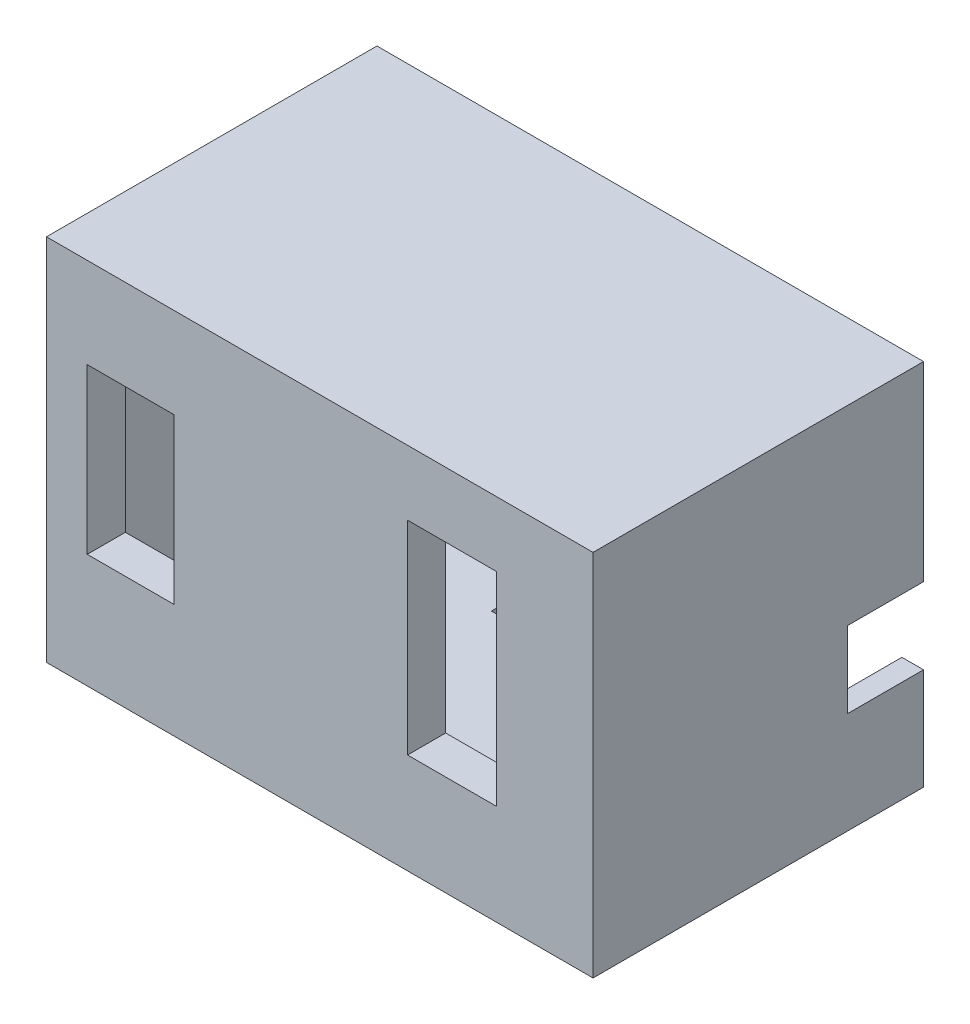
ISO-10303-21;
HEADER;
FILE_DESCRIPTION(('STEP AP214'),'2;1');
FILE_NAME('part.step','',(''),(''),'','','');
FILE_SCHEMA(('AUTOMOTIVE_DESIGN { 1 0 10303 214 1 1 1 1 }'));
ENDSEC;
DATA;
#1=APPLICATION_CONTEXT('core data for automotive mechanical design processes');
#2=APPLICATION_PROTOCOL_DEFINITION('international standard','automotive_design',2000,#1);
#3=PRODUCT_CONTEXT('',#1,'mechanical');
#4=PRODUCT('Part','Part','',(#3));
#5=PRODUCT_RELATED_PRODUCT_CATEGORY('part','',(#4));
#6=PRODUCT_DEFINITION_FORMATION('','',#4);
#7=PRODUCT_DEFINITION_CONTEXT('part definition',#1,'design');
#8=PRODUCT_DEFINITION('design','',#6,#7);
#9=PRODUCT_DEFINITION_SHAPE('','',#8);
#10=(LENGTH_UNIT() NAMED_UNIT(*) SI_UNIT(.MILLI.,.METRE.));
#11=(NAMED_UNIT(*) PLANE_ANGLE_UNIT() SI_UNIT($,.RADIAN.));
#12=(NAMED_UNIT(*) SI_UNIT($,.STERADIAN.) SOLID_ANGLE_UNIT());
#13=UNCERTAINTY_MEASURE_WITH_UNIT(LENGTH_MEASURE(1.E-05),#10,'distance_accuracy_value','');
#14=(GEOMETRIC_REPRESENTATION_CONTEXT(3) GLOBAL_UNCERTAINTY_ASSIGNED_CONTEXT((#13)) GLOBAL_UNIT_ASSIGNED_CONTEXT((#10,
#11,#12)) REPRESENTATION_CONTEXT('',''));
#15=CARTESIAN_POINT('',(0.,0.,0.));
#16=DIRECTION('',(0.,0.,1.));
#17=DIRECTION('',(1.,0.,0.));
#18=AXIS2_PLACEMENT_3D('',#15,#16,#17);
#19=CARTESIAN_POINT('',(0.,0.,0.));
#20=DIRECTION('',(0.,0.,1.));
#21=DIRECTION('',(1.,0.,0.));
#22=AXIS2_PLACEMENT_3D('',#19,#20,#21);
#23=PLANE('',#22);
#24=DIRECTION('',(-1.,0.,0.));
#25=VECTOR('',#24,1.);
#26=CARTESIAN_POINT('',(99.,-62.5,0.));
#27=LINE('',#26,#25);
#28=CARTESIAN_POINT('',(-27.5,-62.5,0.));
#29=VERTEX_POINT('',#28);
#30=CARTESIAN_POINT('',(-99.,-62.5,0.));
#31=VERTEX_POINT('',#30);
#32=EDGE_CURVE('E427',#29,#31,#27,.T.);
#33=ORIENTED_EDGE('',*,*,#32,.F.);
#34=DIRECTION('',(0.,-1.,0.));
#35=VECTOR('',#34,1.);
#36=CARTESIAN_POINT('',(-27.5,42.5,0.));
#37=LINE('',#36,#35);
#38=CARTESIAN_POINT('',(-27.5,-72.5,0.));
#39=VERTEX_POINT('',#38);
#40=EDGE_CURVE('E334',#29,#39,#37,.T.);
#41=ORIENTED_EDGE('',*,*,#40,.T.);
#42=DIRECTION('',(1.,0.,0.));
#43=VECTOR('',#42,1.);
#44=CARTESIAN_POINT('',(-107.5,-72.5,0.));
#45=LINE('',#44,#43);
#46=CARTESIAN_POINT('',(-107.5,-72.5,0.));
#47=VERTEX_POINT('',#46);
#48=EDGE_CURVE('E261',#47,#39,#45,.T.);
#49=ORIENTED_EDGE('',*,*,#48,.F.);
#50=DIRECTION('',(0.,-1.,0.));
#51=VECTOR('',#50,1.);
#52=CARTESIAN_POINT('',(-107.5,72.5,0.));
#53=LINE('',#52,#51);
#54=CARTESIAN_POINT('',(-107.5,-32.5,0.));
#55=VERTEX_POINT('',#54);
#56=EDGE_CURVE('E268',#55,#47,#53,.T.);
#57=ORIENTED_EDGE('',*,*,#56,.F.);
#58=DIRECTION('',(-1.,0.,0.));
#59=VECTOR('',#58,1.);
#60=CARTESIAN_POINT('',(107.5,-32.4999999999999,0.));
#61=LINE('',#60,#59);
#62=CARTESIAN_POINT('',(-99.,-32.5,0.));
#63=VERTEX_POINT('',#62);
#64=EDGE_CURVE('E474',#63,#55,#61,.T.);
#65=ORIENTED_EDGE('',*,*,#64,.F.);
#66=DIRECTION('',(0.,1.,0.));
#67=VECTOR('',#66,1.);
#68=CARTESIAN_POINT('',(-99.,62.5,0.));
#69=LINE('',#68,#67);
#70=EDGE_CURVE('E416',#31,#63,#69,.T.);
#71=ORIENTED_EDGE('',*,*,#70,.F.);
#72=EDGE_LOOP('',(#33,#41,#49,#57,#65,#71));
#73=FACE_BOUND('',#72,.T.);
#74=ADVANCED_FACE('F45',(#73),#23,.F.);
#75=CARTESIAN_POINT('',(107.5,-2.49999999999994,0.));
#76=DIRECTION('',(0.,1.,0.));
#77=DIRECTION('',(-1.,0.,0.));
#78=AXIS2_PLACEMENT_3D('',#75,#76,#77);
#79=PLANE('',#78);
#80=DIRECTION('',(-1.,0.,0.));
#81=VECTOR('',#80,1.);
#82=CARTESIAN_POINT('',(107.5,-2.49999999999994,0.));
#83=LINE('',#82,#81);
#84=CARTESIAN_POINT('',(-99.,-2.49999999999996,0.));
#85=VERTEX_POINT('',#84);
#86=CARTESIAN_POINT('',(-107.5,-2.49999999999998,0.));
#87=VERTEX_POINT('',#86);
#88=EDGE_CURVE('E490',#85,#87,#83,.T.);
#89=ORIENTED_EDGE('',*,*,#88,.F.);
#90=DIRECTION('',(0.,0.,1.));
#91=VECTOR('',#90,1.);
#92=CARTESIAN_POINT('',(-99.,-2.49999999999998,0.));
#93=LINE('',#92,#91);
#94=CARTESIAN_POINT('',(-99.,-2.49999999999994,30.));
#95=VERTEX_POINT('',#94);
#96=EDGE_CURVE('E456',#85,#95,#93,.T.);
#97=ORIENTED_EDGE('',*,*,#96,.T.);
#98=DIRECTION('',(-1.,0.,0.));
#99=VECTOR('',#98,1.);
#100=CARTESIAN_POINT('',(107.5,-2.49999999999994,30.));
#101=LINE('',#100,#99);
#102=CARTESIAN_POINT('',(-107.5,-2.49999999999998,30.));
#103=VERTEX_POINT('',#102);
#104=EDGE_CURVE('E495',#95,#103,#101,.T.);
#105=ORIENTED_EDGE('',*,*,#104,.T.);
#106=DIRECTION('',(0.,0.,-1.));
#107=VECTOR('',#106,1.);
#108=CARTESIAN_POINT('',(-107.5,-2.49999999999998,0.));
#109=LINE('',#108,#107);
#110=EDGE_CURVE('E466',#103,#87,#109,.T.);
#111=ORIENTED_EDGE('',*,*,#110,.T.);
#112=EDGE_LOOP('',(#89,#97,#105,#111));
#113=FACE_BOUND('',#112,.T.);
#114=ADVANCED_FACE('F552',(#113),#79,.F.);
#115=CARTESIAN_POINT('',(107.5,-2.49999999999994,30.));
#116=DIRECTION('',(0.,0.,1.));
#117=DIRECTION('',(0.,-1.,0.));
#118=AXIS2_PLACEMENT_3D('',#115,#116,#117);
#119=PLANE('',#118);
#120=ORIENTED_EDGE('',*,*,#104,.F.);
#121=DIRECTION('',(0.,-1.,0.));
#122=VECTOR('',#121,1.);
#123=CARTESIAN_POINT('',(-99.,-2.49999999999989,30.));
#124=LINE('',#123,#122);
#125=CARTESIAN_POINT('',(-99.,-32.5,30.));
#126=VERTEX_POINT('',#125);
#127=EDGE_CURVE('E452',#95,#126,#124,.T.);
#128=ORIENTED_EDGE('',*,*,#127,.T.);
#129=DIRECTION('',(-1.,0.,0.));
#130=VECTOR('',#129,1.);
#131=CARTESIAN_POINT('',(107.5,-32.4999999999999,30.));
#132=LINE('',#131,#130);
#133=CARTESIAN_POINT('',(-107.5,-32.5,30.));
#134=VERTEX_POINT('',#133);
#135=EDGE_CURVE('E500',#126,#134,#132,.T.);
#136=ORIENTED_EDGE('',*,*,#135,.T.);
#137=DIRECTION('',(0.,1.,0.));
#138=VECTOR('',#137,1.);
#139=CARTESIAN_POINT('',(-107.5,-2.49999999999998,30.));
#140=LINE('',#139,#138);
#141=EDGE_CURVE('E478',#134,#103,#140,.T.);
#142=ORIENTED_EDGE('',*,*,#141,.T.);
#143=EDGE_LOOP('',(#120,#128,#136,#142));
#144=FACE_BOUND('',#143,.T.);
#145=ADVANCED_FACE('F559',(#144),#119,.F.);
#146=CARTESIAN_POINT('',(107.5,-32.4999999999999,30.));
#147=DIRECTION('',(0.,-1.,0.));
#148=DIRECTION('',(0.,0.,-1.));
#149=AXIS2_PLACEMENT_3D('',#146,#147,#148);
#150=PLANE('',#149);
#151=ORIENTED_EDGE('',*,*,#135,.F.);
#152=DIRECTION('',(0.,0.,-1.));
#153=VECTOR('',#152,1.);
#154=CARTESIAN_POINT('',(-99.,-32.5,30.));
#155=LINE('',#154,#153);
#156=EDGE_CURVE('E292',#126,#63,#155,.T.);
#157=ORIENTED_EDGE('',*,*,#156,.T.);
#158=ORIENTED_EDGE('',*,*,#64,.T.);
#159=DIRECTION('',(0.,0.,1.));
#160=VECTOR('',#159,1.);
#161=CARTESIAN_POINT('',(-107.5,-32.5,30.));
#162=LINE('',#161,#160);
#163=EDGE_CURVE('E460',#55,#134,#162,.T.);
#164=ORIENTED_EDGE('',*,*,#163,.T.);
#165=EDGE_LOOP('',(#151,#157,#158,#164));
#166=FACE_BOUND('',#165,.T.);
#167=ADVANCED_FACE('F566',(#166),#150,.F.);
#168=DIRECTION('',(1.,0.,0.));
#169=VECTOR('',#168,1.);
#170=CARTESIAN_POINT('',(99.,62.5,0.));
#171=LINE('',#170,#169);
#172=CARTESIAN_POINT('',(-99.,62.5,0.));
#173=VERTEX_POINT('',#172);
#174=CARTESIAN_POINT('',(99.,62.5,0.));
#175=VERTEX_POINT('',#174);
#176=EDGE_CURVE('E419',#173,#175,#171,.T.);
#177=ORIENTED_EDGE('',*,*,#176,.F.);
#178=EDGE_CURVE('E388',#85,#173,#69,.T.);
#179=ORIENTED_EDGE('',*,*,#178,.F.);
#180=ORIENTED_EDGE('',*,*,#88,.T.);
#181=CARTESIAN_POINT('',(-107.5,72.5,0.));
#182=VERTEX_POINT('',#181);
#183=EDGE_CURVE('E262',#182,#87,#53,.T.);
#184=ORIENTED_EDGE('',*,*,#183,.F.);
#185=DIRECTION('',(-1.,0.,0.));
#186=VECTOR('',#185,1.);
#187=CARTESIAN_POINT('',(-107.5,72.5,0.));
#188=LINE('',#187,#186);
#189=CARTESIAN_POINT('',(107.5,72.5,0.));
#190=VERTEX_POINT('',#189);
#191=EDGE_CURVE('E517',#190,#182,#188,.T.);
#192=ORIENTED_EDGE('',*,*,#191,.F.);
#193=DIRECTION('',(0.,1.,0.));
#194=VECTOR('',#193,1.);
#195=CARTESIAN_POINT('',(107.5,72.5,0.));
#196=LINE('',#195,#194);
#197=CARTESIAN_POINT('',(107.5,-2.49999999999994,0.));
#198=VERTEX_POINT('',#197);
#199=EDGE_CURVE('E489',#198,#190,#196,.T.);
#200=ORIENTED_EDGE('',*,*,#199,.F.);
#201=CARTESIAN_POINT('',(99.,-2.49999999999996,0.));
#202=VERTEX_POINT('',#201);
#203=EDGE_CURVE('E485',#198,#202,#83,.T.);
#204=ORIENTED_EDGE('',*,*,#203,.T.);
#205=DIRECTION('',(0.,-1.,0.));
#206=VECTOR('',#205,1.);
#207=CARTESIAN_POINT('',(99.,62.5,0.));
#208=LINE('',#207,#206);
#209=EDGE_CURVE('E424',#175,#202,#208,.T.);
#210=ORIENTED_EDGE('',*,*,#209,.F.);
#211=EDGE_LOOP('',(#177,#179,#180,#184,#192,#200,#204,#210));
#212=FACE_BOUND('',#211,.T.);
#213=ADVANCED_FACE('F554',(#212),#23,.F.);
#214=CARTESIAN_POINT('',(107.5,72.5,130.));
#215=DIRECTION('',(-1.,0.,0.));
#216=DIRECTION('',(0.,-1.,0.));
#217=AXIS2_PLACEMENT_3D('',#214,#215,#216);
#218=PLANE('',#217);
#219=DIRECTION('',(0.,1.,0.));
#220=VECTOR('',#219,1.);
#221=CARTESIAN_POINT('',(107.5,-2.49999999999994,30.));
#222=LINE('',#221,#220);
#223=CARTESIAN_POINT('',(107.5,-32.4999999999999,30.));
#224=VERTEX_POINT('',#223);
#225=CARTESIAN_POINT('',(107.5,-2.49999999999994,30.));
#226=VERTEX_POINT('',#225);
#227=EDGE_CURVE('E465',#224,#226,#222,.T.);
#228=ORIENTED_EDGE('',*,*,#227,.T.);
#229=DIRECTION('',(0.,0.,-1.));
#230=VECTOR('',#229,1.);
#231=CARTESIAN_POINT('',(107.5,-2.49999999999994,0.));
#232=LINE('',#231,#230);
#233=EDGE_CURVE('E470',#226,#198,#232,.T.);
#234=ORIENTED_EDGE('',*,*,#233,.T.);
#235=ORIENTED_EDGE('',*,*,#199,.T.);
#236=DIRECTION('',(0.,0.,-1.));
#237=VECTOR('',#236,1.);
#238=CARTESIAN_POINT('',(107.5,72.5,130.));
#239=LINE('',#238,#237);
#240=CARTESIAN_POINT('',(107.5,72.5,130.));
#241=VERTEX_POINT('',#240);
#242=EDGE_CURVE('E284',#241,#190,#239,.T.);
#243=ORIENTED_EDGE('',*,*,#242,.F.);
#244=DIRECTION('',(0.,1.,0.));
#245=VECTOR('',#244,1.);
#246=CARTESIAN_POINT('',(107.5,72.5,130.));
#247=LINE('',#246,#245);
#248=CARTESIAN_POINT('',(107.5,-72.5,130.));
#249=VERTEX_POINT('',#248);
#250=EDGE_CURVE('E266',#249,#241,#247,.T.);
#251=ORIENTED_EDGE('',*,*,#250,.F.);
#252=DIRECTION('',(0.,0.,-1.));
#253=VECTOR('',#252,1.);
#254=CARTESIAN_POINT('',(107.5,-72.5,130.));
#255=LINE('',#254,#253);
#256=CARTESIAN_POINT('',(107.5,-72.5,0.));
#257=VERTEX_POINT('',#256);
#258=EDGE_CURVE('E272',#249,#257,#255,.T.);
#259=ORIENTED_EDGE('',*,*,#258,.T.);
#260=CARTESIAN_POINT('',(107.5,-32.4999999999999,0.));
#261=VERTEX_POINT('',#260);
#262=EDGE_CURVE('E259',#257,#261,#196,.T.);
#263=ORIENTED_EDGE('',*,*,#262,.T.);
#264=DIRECTION('',(0.,0.,1.));
#265=VECTOR('',#264,1.);
#266=CARTESIAN_POINT('',(107.5,-32.4999999999999,30.));
#267=LINE('',#266,#265);
#268=EDGE_CURVE('E461',#261,#224,#267,.T.);
#269=ORIENTED_EDGE('',*,*,#268,.T.);
#270=EDGE_LOOP('',(#228,#234,#235,#243,#251,#259,#263,#269));
#271=FACE_BOUND('',#270,.T.);
#272=ADVANCED_FACE('F47',(#271),#218,.F.);
#273=CARTESIAN_POINT('',(-107.5,72.5,130.));
#274=DIRECTION('',(0.,-1.,0.));
#275=DIRECTION('',(0.,0.,-1.));
#276=AXIS2_PLACEMENT_3D('',#273,#274,#275);
#277=PLANE('',#276);
#278=ORIENTED_EDGE('',*,*,#191,.T.);
#279=DIRECTION('',(0.,0.,-1.));
#280=VECTOR('',#279,1.);
#281=CARTESIAN_POINT('',(-107.5,72.5,130.));
#282=LINE('',#281,#280);
#283=CARTESIAN_POINT('',(-107.5,72.5,130.));
#284=VERTEX_POINT('',#283);
#285=EDGE_CURVE('E280',#284,#182,#282,.T.);
#286=ORIENTED_EDGE('',*,*,#285,.F.);
#287=DIRECTION('',(-1.,0.,0.));
#288=VECTOR('',#287,1.);
#289=CARTESIAN_POINT('',(-107.5,72.5,130.));
#290=LINE('',#289,#288);
#291=EDGE_CURVE('E508',#241,#284,#290,.T.);
#292=ORIENTED_EDGE('',*,*,#291,.F.);
#293=ORIENTED_EDGE('',*,*,#242,.T.);
#294=EDGE_LOOP('',(#278,#286,#292,#293));
#295=FACE_BOUND('',#294,.T.);
#296=ADVANCED_FACE('F791',(#295),#277,.F.);
#297=CARTESIAN_POINT('',(-107.5,72.5,130.));
#298=DIRECTION('',(1.,0.,0.));
#299=DIRECTION('',(0.,1.,0.));
#300=AXIS2_PLACEMENT_3D('',#297,#298,#299);
#301=PLANE('',#300);
#302=ORIENTED_EDGE('',*,*,#183,.T.);
#303=ORIENTED_EDGE('',*,*,#110,.F.);
#304=ORIENTED_EDGE('',*,*,#141,.F.);
#305=ORIENTED_EDGE('',*,*,#163,.F.);
#306=ORIENTED_EDGE('',*,*,#56,.T.);
#307=DIRECTION('',(0.,0.,-1.));
#308=VECTOR('',#307,1.);
#309=CARTESIAN_POINT('',(-107.5,-72.5,130.));
#310=LINE('',#309,#308);
#311=CARTESIAN_POINT('',(-107.5,-72.5,130.));
#312=VERTEX_POINT('',#311);
#313=EDGE_CURVE('E275',#312,#47,#310,.T.);
#314=ORIENTED_EDGE('',*,*,#313,.F.);
#315=DIRECTION('',(0.,-1.,0.));
#316=VECTOR('',#315,1.);
#317=CARTESIAN_POINT('',(-107.5,72.5,130.));
#318=LINE('',#317,#316);
#319=EDGE_CURVE('E511',#284,#312,#318,.T.);
#320=ORIENTED_EDGE('',*,*,#319,.F.);
#321=ORIENTED_EDGE('',*,*,#285,.T.);
#322=EDGE_LOOP('',(#302,#303,#304,#305,#306,#314,#320,#321));
#323=FACE_BOUND('',#322,.T.);
#324=ADVANCED_FACE('F527',(#323),#301,.F.);
#325=CARTESIAN_POINT('',(-107.5,-72.5,130.));
#326=DIRECTION('',(0.,1.,0.));
#327=DIRECTION('',(0.,0.,1.));
#328=AXIS2_PLACEMENT_3D('',#325,#326,#327);
#329=PLANE('',#328);
#330=ORIENTED_EDGE('',*,*,#48,.T.);
#331=DIRECTION('',(0.,0.,-1.));
#332=VECTOR('',#331,1.);
#333=CARTESIAN_POINT('',(-27.5,-72.5,0.));
#334=LINE('',#333,#332);
#335=CARTESIAN_POINT('',(-27.5,-72.5,35.));
#336=VERTEX_POINT('',#335);
#337=EDGE_CURVE('E242',#336,#39,#334,.T.);
#338=ORIENTED_EDGE('',*,*,#337,.F.);
#339=DIRECTION('',(-1.,0.,0.));
#340=VECTOR('',#339,1.);
#341=CARTESIAN_POINT('',(-27.5,-72.5,35.));
#342=LINE('',#341,#340);
#343=CARTESIAN_POINT('',(32.5,-72.5,35.));
#344=VERTEX_POINT('',#343);
#345=EDGE_CURVE('E252',#344,#336,#342,.T.);
#346=ORIENTED_EDGE('',*,*,#345,.F.);
#347=DIRECTION('',(0.,0.,1.));
#348=VECTOR('',#347,1.);
#349=CARTESIAN_POINT('',(32.5,-72.5,35.));
#350=LINE('',#349,#348);
#351=CARTESIAN_POINT('',(32.5,-72.5,0.));
#352=VERTEX_POINT('',#351);
#353=EDGE_CURVE('E233',#352,#344,#350,.T.);
#354=ORIENTED_EDGE('',*,*,#353,.F.);
#355=EDGE_CURVE('E248',#352,#257,#45,.T.);
#356=ORIENTED_EDGE('',*,*,#355,.T.);
#357=ORIENTED_EDGE('',*,*,#258,.F.);
#358=DIRECTION('',(1.,0.,0.));
#359=VECTOR('',#358,1.);
#360=CARTESIAN_POINT('',(-107.5,-72.5,130.));
#361=LINE('',#360,#359);
#362=EDGE_CURVE('E276',#312,#249,#361,.T.);
#363=ORIENTED_EDGE('',*,*,#362,.F.);
#364=ORIENTED_EDGE('',*,*,#313,.T.);
#365=EDGE_LOOP('',(#330,#338,#346,#354,#356,#357,#363,#364));
#366=FACE_BOUND('',#365,.T.);
#367=ADVANCED_FACE('F246',(#366),#329,.F.);
#368=CARTESIAN_POINT('',(0.,0.,130.));
#369=DIRECTION('',(0.,0.,1.));
#370=DIRECTION('',(1.,0.,0.));
#371=AXIS2_PLACEMENT_3D('',#368,#369,#370);
#372=PLANE('',#371);
#373=DIRECTION('',(-1.,0.,0.));
#374=VECTOR('',#373,1.);
#375=CARTESIAN_POINT('',(34.5316519229563,46.9849408979848,130.));
#376=LINE('',#375,#374);
#377=CARTESIAN_POINT('',(69.5316519229563,46.9849408979848,130.));
#378=VERTEX_POINT('',#377);
#379=CARTESIAN_POINT('',(34.5316519229563,46.9849408979848,130.));
#380=VERTEX_POINT('',#379);
#381=EDGE_CURVE('E69',#378,#380,#376,.T.);
#382=ORIENTED_EDGE('',*,*,#381,.F.);
#383=DIRECTION('',(0.,1.,0.));
#384=VECTOR('',#383,1.);
#385=CARTESIAN_POINT('',(69.5316519229563,46.9849408979848,130.));
#386=LINE('',#385,#384);
#387=CARTESIAN_POINT('',(69.5316519229563,-33.0150591020152,130.));
#388=VERTEX_POINT('',#387);
#389=EDGE_CURVE('E353',#388,#378,#386,.T.);
#390=ORIENTED_EDGE('',*,*,#389,.F.);
#391=DIRECTION('',(1.,0.,0.));
#392=VECTOR('',#391,1.);
#393=CARTESIAN_POINT('',(34.5316519229563,-33.0150591020152,130.));
#394=LINE('',#393,#392);
#395=CARTESIAN_POINT('',(34.5316519229563,-33.0150591020152,130.));
#396=VERTEX_POINT('',#395);
#397=EDGE_CURVE('E349',#396,#388,#394,.T.);
#398=ORIENTED_EDGE('',*,*,#397,.F.);
#399=DIRECTION('',(0.,-1.,0.));
#400=VECTOR('',#399,1.);
#401=CARTESIAN_POINT('',(34.5316519229563,46.9849408979848,130.));
#402=LINE('',#401,#400);
#403=EDGE_CURVE('E345',#380,#396,#402,.T.);
#404=ORIENTED_EDGE('',*,*,#403,.F.);
#405=EDGE_LOOP('',(#382,#390,#398,#404));
#406=FACE_BOUND('',#405,.T.);
#407=DIRECTION('',(-1.,0.,0.));
#408=VECTOR('',#407,1.);
#409=CARTESIAN_POINT('',(-57.3972052232922,36.981532633707,130.));
#410=LINE('',#409,#408);
#411=CARTESIAN_POINT('',(-57.3972052232922,36.981532633707,130.));
#412=VERTEX_POINT('',#411);
#413=CARTESIAN_POINT('',(-91.4622132013436,36.981532633707,130.));
#414=VERTEX_POINT('',#413);
#415=EDGE_CURVE('E361',#412,#414,#410,.T.);
#416=ORIENTED_EDGE('',*,*,#415,.F.);
#417=DIRECTION('',(0.,1.,0.));
#418=VECTOR('',#417,1.);
#419=CARTESIAN_POINT('',(-57.3972052232922,-27.6486537356098,130.));
#420=LINE('',#419,#418);
#421=CARTESIAN_POINT('',(-57.3972052232922,-27.6486537356098,130.));
#422=VERTEX_POINT('',#421);
#423=EDGE_CURVE('E380',#422,#412,#420,.T.);
#424=ORIENTED_EDGE('',*,*,#423,.F.);
#425=DIRECTION('',(1.,0.,0.));
#426=VECTOR('',#425,1.);
#427=CARTESIAN_POINT('',(-91.4622132013436,-27.6486537356098,130.));
#428=LINE('',#427,#426);
#429=CARTESIAN_POINT('',(-91.4622132013436,-27.6486537356098,130.));
#430=VERTEX_POINT('',#429);
#431=EDGE_CURVE('E376',#430,#422,#428,.T.);
#432=ORIENTED_EDGE('',*,*,#431,.F.);
#433=DIRECTION('',(0.,-1.,0.));
#434=VECTOR('',#433,1.);
#435=CARTESIAN_POINT('',(-91.4622132013436,36.981532633707,130.));
#436=LINE('',#435,#434);
#437=EDGE_CURVE('E372',#414,#430,#436,.T.);
#438=ORIENTED_EDGE('',*,*,#437,.F.);
#439=EDGE_LOOP('',(#416,#424,#432,#438));
#440=FACE_BOUND('',#439,.T.);
#441=ORIENTED_EDGE('',*,*,#250,.T.);
#442=ORIENTED_EDGE('',*,*,#291,.T.);
#443=ORIENTED_EDGE('',*,*,#319,.T.);
#444=ORIENTED_EDGE('',*,*,#362,.T.);
#445=EDGE_LOOP('',(#441,#442,#443,#444));
#446=FACE_BOUND('',#445,.T.);
#447=ADVANCED_FACE('F569',(#406,#440,#446),#372,.T.);
#448=ORIENTED_EDGE('',*,*,#355,.F.);
#449=DIRECTION('',(0.,-1.,0.));
#450=VECTOR('',#449,1.);
#451=CARTESIAN_POINT('',(32.5,42.5,0.));
#452=LINE('',#451,#450);
#453=CARTESIAN_POINT('',(32.5,-62.5,0.));
#454=VERTEX_POINT('',#453);
#455=EDGE_CURVE('E230',#454,#352,#452,.T.);
#456=ORIENTED_EDGE('',*,*,#455,.F.);
#457=CARTESIAN_POINT('',(99.,-62.5,0.));
#458=VERTEX_POINT('',#457);
#459=EDGE_CURVE('E403',#458,#454,#27,.T.);
#460=ORIENTED_EDGE('',*,*,#459,.F.);
#461=CARTESIAN_POINT('',(99.,-32.5,0.));
#462=VERTEX_POINT('',#461);
#463=EDGE_CURVE('E423',#462,#458,#208,.T.);
#464=ORIENTED_EDGE('',*,*,#463,.F.);
#465=EDGE_CURVE('E501',#261,#462,#61,.T.);
#466=ORIENTED_EDGE('',*,*,#465,.F.);
#467=ORIENTED_EDGE('',*,*,#262,.F.);
#468=EDGE_LOOP('',(#448,#456,#460,#464,#466,#467));
#469=FACE_BOUND('',#468,.T.);
#470=ADVANCED_FACE('F256',(#469),#23,.F.);
#471=CARTESIAN_POINT('',(99.,-2.49999999999994,30.));
#472=VERTEX_POINT('',#471);
#473=EDGE_CURVE('E491',#226,#472,#101,.T.);
#474=ORIENTED_EDGE('',*,*,#473,.T.);
#475=DIRECTION('',(0.,0.,-1.));
#476=VECTOR('',#475,1.);
#477=CARTESIAN_POINT('',(99.,-2.49999999999994,0.));
#478=LINE('',#477,#476);
#479=EDGE_CURVE('E448',#472,#202,#478,.T.);
#480=ORIENTED_EDGE('',*,*,#479,.T.);
#481=ORIENTED_EDGE('',*,*,#203,.F.);
#482=ORIENTED_EDGE('',*,*,#233,.F.);
#483=EDGE_LOOP('',(#474,#480,#481,#482));
#484=FACE_BOUND('',#483,.T.);
#485=ADVANCED_FACE('F562',(#484),#79,.F.);
#486=CARTESIAN_POINT('',(99.,-32.4999999999999,30.));
#487=VERTEX_POINT('',#486);
#488=EDGE_CURVE('E496',#224,#487,#132,.T.);
#489=ORIENTED_EDGE('',*,*,#488,.T.);
#490=DIRECTION('',(0.,1.,0.));
#491=VECTOR('',#490,1.);
#492=CARTESIAN_POINT('',(99.,-2.49999999999994,30.));
#493=LINE('',#492,#491);
#494=EDGE_CURVE('E434',#487,#472,#493,.T.);
#495=ORIENTED_EDGE('',*,*,#494,.T.);
#496=ORIENTED_EDGE('',*,*,#473,.F.);
#497=ORIENTED_EDGE('',*,*,#227,.F.);
#498=EDGE_LOOP('',(#489,#495,#496,#497));
#499=FACE_BOUND('',#498,.T.);
#500=ADVANCED_FACE('F573',(#499),#119,.F.);
#501=ORIENTED_EDGE('',*,*,#465,.T.);
#502=DIRECTION('',(0.,0.,1.));
#503=VECTOR('',#502,1.);
#504=CARTESIAN_POINT('',(99.,-32.4999999999999,30.));
#505=LINE('',#504,#503);
#506=EDGE_CURVE('E288',#462,#487,#505,.T.);
#507=ORIENTED_EDGE('',*,*,#506,.T.);
#508=ORIENTED_EDGE('',*,*,#488,.F.);
#509=ORIENTED_EDGE('',*,*,#268,.F.);
#510=EDGE_LOOP('',(#501,#507,#508,#509));
#511=FACE_BOUND('',#510,.T.);
#512=ADVANCED_FACE('F583',(#511),#150,.F.);
#513=CARTESIAN_POINT('',(-99.,62.5,115.));
#514=DIRECTION('',(-1.,0.,0.));
#515=DIRECTION('',(0.,-1.,0.));
#516=AXIS2_PLACEMENT_3D('',#513,#514,#515);
#517=PLANE('',#516);
#518=ORIENTED_EDGE('',*,*,#178,.T.);
#519=DIRECTION('',(0.,0.,-1.));
#520=VECTOR('',#519,1.);
#521=CARTESIAN_POINT('',(-99.,62.5,115.));
#522=LINE('',#521,#520);
#523=CARTESIAN_POINT('',(-99.,62.5,115.));
#524=VERTEX_POINT('',#523);
#525=EDGE_CURVE('E415',#524,#173,#522,.T.);
#526=ORIENTED_EDGE('',*,*,#525,.F.);
#527=DIRECTION('',(0.,1.,0.));
#528=VECTOR('',#527,1.);
#529=CARTESIAN_POINT('',(-99.,62.5,115.));
#530=LINE('',#529,#528);
#531=CARTESIAN_POINT('',(-99.,-62.5,115.));
#532=VERTEX_POINT('',#531);
#533=EDGE_CURVE('E398',#532,#524,#530,.T.);
#534=ORIENTED_EDGE('',*,*,#533,.F.);
#535=DIRECTION('',(0.,0.,-1.));
#536=VECTOR('',#535,1.);
#537=CARTESIAN_POINT('',(-99.,-62.5,115.));
#538=LINE('',#537,#536);
#539=EDGE_CURVE('E430',#532,#31,#538,.T.);
#540=ORIENTED_EDGE('',*,*,#539,.T.);
#541=ORIENTED_EDGE('',*,*,#70,.T.);
#542=ORIENTED_EDGE('',*,*,#156,.F.);
#543=ORIENTED_EDGE('',*,*,#127,.F.);
#544=ORIENTED_EDGE('',*,*,#96,.F.);
#545=EDGE_LOOP('',(#518,#526,#534,#540,#541,#542,#543,#544));
#546=FACE_BOUND('',#545,.T.);
#547=ADVANCED_FACE('F586',(#546),#517,.F.);
#548=CARTESIAN_POINT('',(99.,62.5,115.));
#549=DIRECTION('',(1.,0.,0.));
#550=DIRECTION('',(0.,1.,0.));
#551=AXIS2_PLACEMENT_3D('',#548,#549,#550);
#552=PLANE('',#551);
#553=ORIENTED_EDGE('',*,*,#494,.F.);
#554=ORIENTED_EDGE('',*,*,#506,.F.);
#555=ORIENTED_EDGE('',*,*,#463,.T.);
#556=DIRECTION('',(0.,0.,-1.));
#557=VECTOR('',#556,1.);
#558=CARTESIAN_POINT('',(99.,-62.5,115.));
#559=LINE('',#558,#557);
#560=CARTESIAN_POINT('',(99.,-62.5,115.));
#561=VERTEX_POINT('',#560);
#562=EDGE_CURVE('E435',#561,#458,#559,.T.);
#563=ORIENTED_EDGE('',*,*,#562,.F.);
#564=DIRECTION('',(0.,-1.,0.));
#565=VECTOR('',#564,1.);
#566=CARTESIAN_POINT('',(99.,62.5,115.));
#567=LINE('',#566,#565);
#568=CARTESIAN_POINT('',(99.,62.5,115.));
#569=VERTEX_POINT('',#568);
#570=EDGE_CURVE('E407',#569,#561,#567,.T.);
#571=ORIENTED_EDGE('',*,*,#570,.F.);
#572=DIRECTION('',(0.,0.,-1.));
#573=VECTOR('',#572,1.);
#574=CARTESIAN_POINT('',(99.,62.5,115.));
#575=LINE('',#574,#573);
#576=EDGE_CURVE('E439',#569,#175,#575,.T.);
#577=ORIENTED_EDGE('',*,*,#576,.T.);
#578=ORIENTED_EDGE('',*,*,#209,.T.);
#579=ORIENTED_EDGE('',*,*,#479,.F.);
#580=EDGE_LOOP('',(#553,#554,#555,#563,#571,#577,#578,#579));
#581=FACE_BOUND('',#580,.T.);
#582=ADVANCED_FACE('F593',(#581),#552,.F.);
#583=CARTESIAN_POINT('',(99.,-62.5,115.));
#584=DIRECTION('',(0.,-1.,0.));
#585=DIRECTION('',(0.,0.,-1.));
#586=AXIS2_PLACEMENT_3D('',#583,#584,#585);
#587=PLANE('',#586);
#588=DIRECTION('',(-1.,0.,0.));
#589=VECTOR('',#588,1.);
#590=CARTESIAN_POINT('',(99.,-62.5,35.));
#591=LINE('',#590,#589);
#592=CARTESIAN_POINT('',(32.5,-62.5,35.));
#593=VERTEX_POINT('',#592);
#594=CARTESIAN_POINT('',(-27.5,-62.5,35.));
#595=VERTEX_POINT('',#594);
#596=EDGE_CURVE('E54',#593,#595,#591,.T.);
#597=ORIENTED_EDGE('',*,*,#596,.T.);
#598=DIRECTION('',(0.,0.,-1.));
#599=VECTOR('',#598,1.);
#600=CARTESIAN_POINT('',(-27.5,-62.5,115.));
#601=LINE('',#600,#599);
#602=EDGE_CURVE('E11',#595,#29,#601,.T.);
#603=ORIENTED_EDGE('',*,*,#602,.T.);
#604=ORIENTED_EDGE('',*,*,#32,.T.);
#605=ORIENTED_EDGE('',*,*,#539,.F.);
#606=DIRECTION('',(-1.,0.,0.));
#607=VECTOR('',#606,1.);
#608=CARTESIAN_POINT('',(99.,-62.5,115.));
#609=LINE('',#608,#607);
#610=EDGE_CURVE('E411',#561,#532,#609,.T.);
#611=ORIENTED_EDGE('',*,*,#610,.F.);
#612=ORIENTED_EDGE('',*,*,#562,.T.);
#613=ORIENTED_EDGE('',*,*,#459,.T.);
#614=DIRECTION('',(0.,0.,1.));
#615=VECTOR('',#614,1.);
#616=CARTESIAN_POINT('',(32.5,-62.5,115.));
#617=LINE('',#616,#615);
#618=EDGE_CURVE('E236',#454,#593,#617,.T.);
#619=ORIENTED_EDGE('',*,*,#618,.T.);
#620=EDGE_LOOP('',(#597,#603,#604,#605,#611,#612,#613,#619));
#621=FACE_BOUND('',#620,.T.);
#622=ADVANCED_FACE('F326',(#621),#587,.F.);
#623=CARTESIAN_POINT('',(99.,62.5,115.));
#624=DIRECTION('',(0.,1.,0.));
#625=DIRECTION('',(0.,0.,1.));
#626=AXIS2_PLACEMENT_3D('',#623,#624,#625);
#627=PLANE('',#626);
#628=ORIENTED_EDGE('',*,*,#176,.T.);
#629=ORIENTED_EDGE('',*,*,#576,.F.);
#630=DIRECTION('',(1.,0.,0.));
#631=VECTOR('',#630,1.);
#632=CARTESIAN_POINT('',(99.,62.5,115.));
#633=LINE('',#632,#631);
#634=EDGE_CURVE('E402',#524,#569,#633,.T.);
#635=ORIENTED_EDGE('',*,*,#634,.F.);
#636=ORIENTED_EDGE('',*,*,#525,.T.);
#637=EDGE_LOOP('',(#628,#629,#635,#636));
#638=FACE_BOUND('',#637,.T.);
#639=ADVANCED_FACE('F595',(#638),#627,.F.);
#640=CARTESIAN_POINT('',(0.,0.,115.));
#641=DIRECTION('',(0.,0.,-1.));
#642=DIRECTION('',(-1.,0.,0.));
#643=AXIS2_PLACEMENT_3D('',#640,#641,#642);
#644=PLANE('',#643);
#645=DIRECTION('',(1.,0.,0.));
#646=VECTOR('',#645,1.);
#647=CARTESIAN_POINT('',(0.,46.9849408979848,115.));
#648=LINE('',#647,#646);
#649=CARTESIAN_POINT('',(34.5316519229563,46.9849408979848,115.));
#650=VERTEX_POINT('',#649);
#651=CARTESIAN_POINT('',(69.5316519229563,46.9849408979848,115.));
#652=VERTEX_POINT('',#651);
#653=EDGE_CURVE('E319',#650,#652,#648,.T.);
#654=ORIENTED_EDGE('',*,*,#653,.F.);
#655=DIRECTION('',(0.,1.,0.));
#656=VECTOR('',#655,1.);
#657=CARTESIAN_POINT('',(34.5316519229563,0.,115.));
#658=LINE('',#657,#656);
#659=CARTESIAN_POINT('',(34.5316519229563,-33.0150591020152,115.));
#660=VERTEX_POINT('',#659);
#661=EDGE_CURVE('E309',#660,#650,#658,.T.);
#662=ORIENTED_EDGE('',*,*,#661,.F.);
#663=DIRECTION('',(-1.,0.,0.));
#664=VECTOR('',#663,1.);
#665=CARTESIAN_POINT('',(0.,-33.0150591020152,115.));
#666=LINE('',#665,#664);
#667=CARTESIAN_POINT('',(69.5316519229563,-33.0150591020152,115.));
#668=VERTEX_POINT('',#667);
#669=EDGE_CURVE('E312',#668,#660,#666,.T.);
#670=ORIENTED_EDGE('',*,*,#669,.F.);
#671=DIRECTION('',(0.,-1.,0.));
#672=VECTOR('',#671,1.);
#673=CARTESIAN_POINT('',(69.5316519229563,0.,115.));
#674=LINE('',#673,#672);
#675=EDGE_CURVE('E316',#652,#668,#674,.T.);
#676=ORIENTED_EDGE('',*,*,#675,.F.);
#677=EDGE_LOOP('',(#654,#662,#670,#676));
#678=FACE_BOUND('',#677,.T.);
#679=DIRECTION('',(1.,0.,0.));
#680=VECTOR('',#679,1.);
#681=CARTESIAN_POINT('',(0.,36.981532633707,115.));
#682=LINE('',#681,#680);
#683=CARTESIAN_POINT('',(-91.4622132013436,36.981532633707,115.));
#684=VERTEX_POINT('',#683);
#685=CARTESIAN_POINT('',(-57.3972052232922,36.981532633707,115.));
#686=VERTEX_POINT('',#685);
#687=EDGE_CURVE('E306',#684,#686,#682,.T.);
#688=ORIENTED_EDGE('',*,*,#687,.F.);
#689=DIRECTION('',(0.,1.,0.));
#690=VECTOR('',#689,1.);
#691=CARTESIAN_POINT('',(-91.4622132013436,0.,115.));
#692=LINE('',#691,#690);
#693=CARTESIAN_POINT('',(-91.4622132013436,-27.6486537356098,115.));
#694=VERTEX_POINT('',#693);
#695=EDGE_CURVE('E296',#694,#684,#692,.T.);
#696=ORIENTED_EDGE('',*,*,#695,.F.);
#697=DIRECTION('',(-1.,0.,0.));
#698=VECTOR('',#697,1.);
#699=CARTESIAN_POINT('',(0.,-27.6486537356098,115.));
#700=LINE('',#699,#698);
#701=CARTESIAN_POINT('',(-57.3972052232922,-27.6486537356098,115.));
#702=VERTEX_POINT('',#701);
#703=EDGE_CURVE('E299',#702,#694,#700,.T.);
#704=ORIENTED_EDGE('',*,*,#703,.F.);
#705=DIRECTION('',(0.,-1.,0.));
#706=VECTOR('',#705,1.);
#707=CARTESIAN_POINT('',(-57.3972052232922,0.,115.));
#708=LINE('',#707,#706);
#709=EDGE_CURVE('E303',#686,#702,#708,.T.);
#710=ORIENTED_EDGE('',*,*,#709,.F.);
#711=EDGE_LOOP('',(#688,#696,#704,#710));
#712=FACE_BOUND('',#711,.T.);
#713=ORIENTED_EDGE('',*,*,#533,.T.);
#714=ORIENTED_EDGE('',*,*,#634,.T.);
#715=ORIENTED_EDGE('',*,*,#570,.T.);
#716=ORIENTED_EDGE('',*,*,#610,.T.);
#717=EDGE_LOOP('',(#713,#714,#715,#716));
#718=FACE_BOUND('',#717,.T.);
#719=ADVANCED_FACE('F598',(#678,#712,#718),#644,.T.);
#720=CARTESIAN_POINT('',(-57.3972052232922,36.981532633707,15.));
#721=DIRECTION('',(0.,1.,0.));
#722=DIRECTION('',(0.,0.,1.));
#723=AXIS2_PLACEMENT_3D('',#720,#721,#722);
#724=PLANE('',#723);
#725=ORIENTED_EDGE('',*,*,#687,.T.);
#726=DIRECTION('',(0.,0.,1.));
#727=VECTOR('',#726,1.);
#728=CARTESIAN_POINT('',(-57.3972052232922,36.981532633707,15.));
#729=LINE('',#728,#727);
#730=EDGE_CURVE('E385',#686,#412,#729,.T.);
#731=ORIENTED_EDGE('',*,*,#730,.T.);
#732=ORIENTED_EDGE('',*,*,#415,.T.);
#733=DIRECTION('',(0.,0.,1.));
#734=VECTOR('',#733,1.);
#735=CARTESIAN_POINT('',(-91.4622132013436,36.981532633707,15.));
#736=LINE('',#735,#734);
#737=EDGE_CURVE('E384',#684,#414,#736,.T.);
#738=ORIENTED_EDGE('',*,*,#737,.F.);
#739=EDGE_LOOP('',(#725,#731,#732,#738));
#740=FACE_BOUND('',#739,.T.);
#741=ADVANCED_FACE('F605',(#740),#724,.F.);
#742=CARTESIAN_POINT('',(-57.3972052232922,-27.6486537356098,15.));
#743=DIRECTION('',(1.,0.,0.));
#744=DIRECTION('',(0.,0.,-1.));
#745=AXIS2_PLACEMENT_3D('',#742,#743,#744);
#746=PLANE('',#745);
#747=ORIENTED_EDGE('',*,*,#709,.T.);
#748=DIRECTION('',(0.,0.,1.));
#749=VECTOR('',#748,1.);
#750=CARTESIAN_POINT('',(-57.3972052232922,-27.6486537356098,15.));
#751=LINE('',#750,#749);
#752=EDGE_CURVE('E389',#702,#422,#751,.T.);
#753=ORIENTED_EDGE('',*,*,#752,.T.);
#754=ORIENTED_EDGE('',*,*,#423,.T.);
#755=ORIENTED_EDGE('',*,*,#730,.F.);
#756=EDGE_LOOP('',(#747,#753,#754,#755));
#757=FACE_BOUND('',#756,.T.);
#758=ADVANCED_FACE('F609',(#757),#746,.F.);
#759=CARTESIAN_POINT('',(-91.4622132013436,-27.6486537356098,15.));
#760=DIRECTION('',(0.,-1.,0.));
#761=DIRECTION('',(0.,0.,-1.));
#762=AXIS2_PLACEMENT_3D('',#759,#760,#761);
#763=PLANE('',#762);
#764=ORIENTED_EDGE('',*,*,#703,.T.);
#765=DIRECTION('',(0.,0.,1.));
#766=VECTOR('',#765,1.);
#767=CARTESIAN_POINT('',(-91.4622132013436,-27.6486537356098,15.));
#768=LINE('',#767,#766);
#769=EDGE_CURVE('E392',#694,#430,#768,.T.);
#770=ORIENTED_EDGE('',*,*,#769,.T.);
#771=ORIENTED_EDGE('',*,*,#431,.T.);
#772=ORIENTED_EDGE('',*,*,#752,.F.);
#773=EDGE_LOOP('',(#764,#770,#771,#772));
#774=FACE_BOUND('',#773,.T.);
#775=ADVANCED_FACE('F614',(#774),#763,.F.);
#776=CARTESIAN_POINT('',(-91.4622132013436,36.981532633707,15.));
#777=DIRECTION('',(-1.,0.,0.));
#778=DIRECTION('',(0.,0.,1.));
#779=AXIS2_PLACEMENT_3D('',#776,#777,#778);
#780=PLANE('',#779);
#781=ORIENTED_EDGE('',*,*,#695,.T.);
#782=ORIENTED_EDGE('',*,*,#737,.T.);
#783=ORIENTED_EDGE('',*,*,#437,.T.);
#784=ORIENTED_EDGE('',*,*,#769,.F.);
#785=EDGE_LOOP('',(#781,#782,#783,#784));
#786=FACE_BOUND('',#785,.T.);
#787=ADVANCED_FACE('F611',(#786),#780,.F.);
#788=CARTESIAN_POINT('',(34.5316519229563,46.9849408979848,15.));
#789=DIRECTION('',(0.,1.,0.));
#790=DIRECTION('',(0.,0.,1.));
#791=AXIS2_PLACEMENT_3D('',#788,#789,#790);
#792=PLANE('',#791);
#793=ORIENTED_EDGE('',*,*,#653,.T.);
#794=DIRECTION('',(0.,0.,1.));
#795=VECTOR('',#794,1.);
#796=CARTESIAN_POINT('',(69.5316519229563,46.9849408979848,15.));
#797=LINE('',#796,#795);
#798=EDGE_CURVE('E358',#652,#378,#797,.T.);
#799=ORIENTED_EDGE('',*,*,#798,.T.);
#800=ORIENTED_EDGE('',*,*,#381,.T.);
#801=DIRECTION('',(0.,0.,1.));
#802=VECTOR('',#801,1.);
#803=CARTESIAN_POINT('',(34.5316519229563,46.9849408979848,15.));
#804=LINE('',#803,#802);
#805=EDGE_CURVE('E357',#650,#380,#804,.T.);
#806=ORIENTED_EDGE('',*,*,#805,.F.);
#807=EDGE_LOOP('',(#793,#799,#800,#806));
#808=FACE_BOUND('',#807,.T.);
#809=ADVANCED_FACE('F613',(#808),#792,.F.);
#810=CARTESIAN_POINT('',(69.5316519229563,46.9849408979848,15.));
#811=DIRECTION('',(1.,0.,0.));
#812=DIRECTION('',(0.,1.,0.));
#813=AXIS2_PLACEMENT_3D('',#810,#811,#812);
#814=PLANE('',#813);
#815=ORIENTED_EDGE('',*,*,#675,.T.);
#816=DIRECTION('',(0.,0.,1.));
#817=VECTOR('',#816,1.);
#818=CARTESIAN_POINT('',(69.5316519229563,-33.0150591020152,15.));
#819=LINE('',#818,#817);
#820=EDGE_CURVE('E362',#668,#388,#819,.T.);
#821=ORIENTED_EDGE('',*,*,#820,.T.);
#822=ORIENTED_EDGE('',*,*,#389,.T.);
#823=ORIENTED_EDGE('',*,*,#798,.F.);
#824=EDGE_LOOP('',(#815,#821,#822,#823));
#825=FACE_BOUND('',#824,.T.);
#826=ADVANCED_FACE('F623',(#825),#814,.F.);
#827=CARTESIAN_POINT('',(34.5316519229563,-33.0150591020152,15.));
#828=DIRECTION('',(0.,-1.,0.));
#829=DIRECTION('',(0.,0.,-1.));
#830=AXIS2_PLACEMENT_3D('',#827,#828,#829);
#831=PLANE('',#830);
#832=ORIENTED_EDGE('',*,*,#669,.T.);
#833=DIRECTION('',(0.,0.,1.));
#834=VECTOR('',#833,1.);
#835=CARTESIAN_POINT('',(34.5316519229563,-33.0150591020152,15.));
#836=LINE('',#835,#834);
#837=EDGE_CURVE('E365',#660,#396,#836,.T.);
#838=ORIENTED_EDGE('',*,*,#837,.T.);
#839=ORIENTED_EDGE('',*,*,#397,.T.);
#840=ORIENTED_EDGE('',*,*,#820,.F.);
#841=EDGE_LOOP('',(#832,#838,#839,#840));
#842=FACE_BOUND('',#841,.T.);
#843=ADVANCED_FACE('F548',(#842),#831,.F.);
#844=CARTESIAN_POINT('',(34.5316519229563,46.9849408979848,15.));
#845=DIRECTION('',(-1.,0.,0.));
#846=DIRECTION('',(0.,-1.,0.));
#847=AXIS2_PLACEMENT_3D('',#844,#845,#846);
#848=PLANE('',#847);
#849=ORIENTED_EDGE('',*,*,#661,.T.);
#850=ORIENTED_EDGE('',*,*,#805,.T.);
#851=ORIENTED_EDGE('',*,*,#403,.T.);
#852=ORIENTED_EDGE('',*,*,#837,.F.);
#853=EDGE_LOOP('',(#849,#850,#851,#852));
#854=FACE_BOUND('',#853,.T.);
#855=ADVANCED_FACE('F540',(#854),#848,.F.);
#856=CARTESIAN_POINT('',(-27.5,42.5,0.));
#857=DIRECTION('',(-1.,0.,0.));
#858=DIRECTION('',(0.,0.,1.));
#859=AXIS2_PLACEMENT_3D('',#856,#857,#858);
#860=PLANE('',#859);
#861=DIRECTION('',(0.,-1.,0.));
#862=VECTOR('',#861,1.);
#863=CARTESIAN_POINT('',(-27.5,42.5,35.));
#864=LINE('',#863,#862);
#865=EDGE_CURVE('E331',#595,#336,#864,.T.);
#866=ORIENTED_EDGE('',*,*,#865,.T.);
#867=ORIENTED_EDGE('',*,*,#337,.T.);
#868=ORIENTED_EDGE('',*,*,#40,.F.);
#869=ORIENTED_EDGE('',*,*,#602,.F.);
#870=EDGE_LOOP('',(#866,#867,#868,#869));
#871=FACE_BOUND('',#870,.T.);
#872=ADVANCED_FACE('F535',(#871),#860,.F.);
#873=CARTESIAN_POINT('',(-27.5,42.5,35.));
#874=DIRECTION('',(0.,0.,1.));
#875=DIRECTION('',(1.,0.,0.));
#876=AXIS2_PLACEMENT_3D('',#873,#874,#875);
#877=PLANE('',#876);
#878=DIRECTION('',(0.,-1.,0.));
#879=VECTOR('',#878,1.);
#880=CARTESIAN_POINT('',(32.5,42.5,35.));
#881=LINE('',#880,#879);
#882=EDGE_CURVE('E61',#593,#344,#881,.T.);
#883=ORIENTED_EDGE('',*,*,#882,.T.);
#884=ORIENTED_EDGE('',*,*,#345,.T.);
#885=ORIENTED_EDGE('',*,*,#865,.F.);
#886=ORIENTED_EDGE('',*,*,#596,.F.);
#887=EDGE_LOOP('',(#883,#884,#885,#886));
#888=FACE_BOUND('',#887,.T.);
#889=ADVANCED_FACE('F330',(#888),#877,.F.);
#890=CARTESIAN_POINT('',(32.5,42.5,35.));
#891=DIRECTION('',(1.,0.,0.));
#892=DIRECTION('',(0.,0.,-1.));
#893=AXIS2_PLACEMENT_3D('',#890,#891,#892);
#894=PLANE('',#893);
#895=ORIENTED_EDGE('',*,*,#455,.T.);
#896=ORIENTED_EDGE('',*,*,#353,.T.);
#897=ORIENTED_EDGE('',*,*,#882,.F.);
#898=ORIENTED_EDGE('',*,*,#618,.F.);
#899=EDGE_LOOP('',(#895,#896,#897,#898));
#900=FACE_BOUND('',#899,.T.);
#901=ADVANCED_FACE('F232',(#900),#894,.F.);
#902=CLOSED_SHELL('',(#74,#114,#145,#167,#213,#272,#296,#324,#367,#447,#470,#485,#500,#512,#547,
#582,#622,#639,#719,#741,#758,#775,#787,#809,#826,#843,#855,#872,#889,#901));
#903=MANIFOLD_SOLID_BREP('B2',#902);
#904=ADVANCED_BREP_SHAPE_REPRESENTATION('',(#18,#903),#14);
#905=SHAPE_DEFINITION_REPRESENTATION(#9,#904);
ENDSEC;
END-ISO-10303-21;
